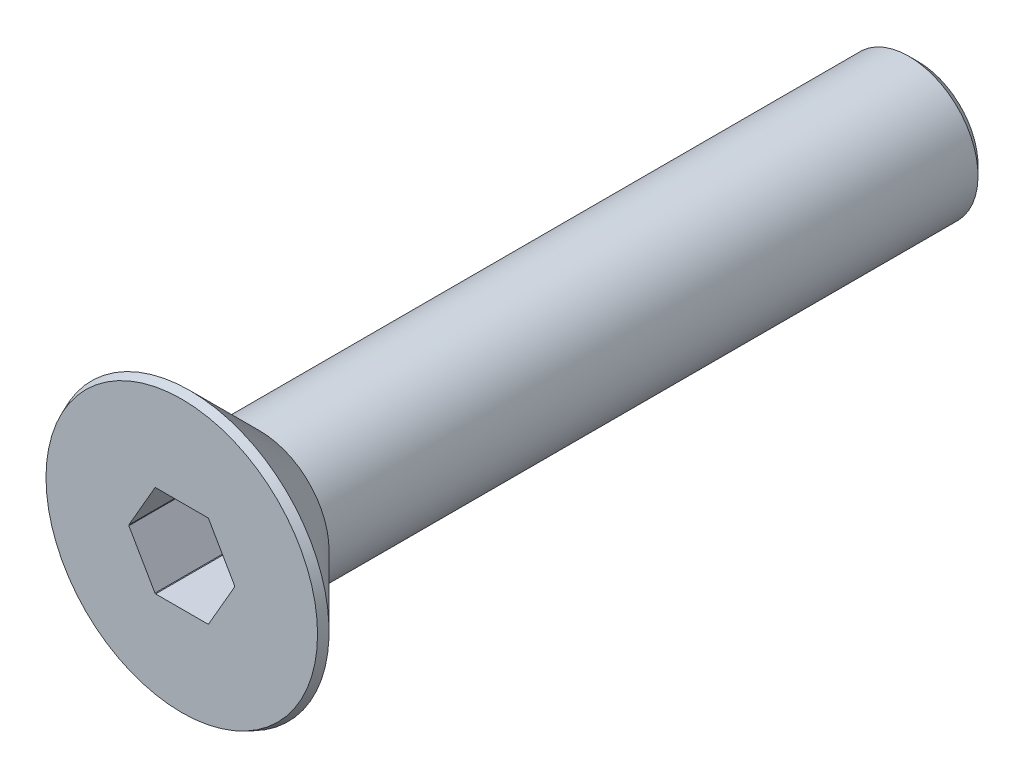
ISO-10303-21;
HEADER;
FILE_DESCRIPTION(('STEP AP214'),'2;1');
FILE_NAME('part.step','',(''),(''),'','','');
FILE_SCHEMA(('AUTOMOTIVE_DESIGN { 1 0 10303 214 1 1 1 1 }'));
ENDSEC;
DATA;
#1=APPLICATION_CONTEXT('core data for automotive mechanical design processes');
#2=APPLICATION_PROTOCOL_DEFINITION('international standard','automotive_design',2000,#1);
#3=PRODUCT_CONTEXT('',#1,'mechanical');
#4=PRODUCT('Part','Part','',(#3));
#5=PRODUCT_RELATED_PRODUCT_CATEGORY('part','',(#4));
#6=PRODUCT_DEFINITION_FORMATION('','',#4);
#7=PRODUCT_DEFINITION_CONTEXT('part definition',#1,'design');
#8=PRODUCT_DEFINITION('design','',#6,#7);
#9=PRODUCT_DEFINITION_SHAPE('','',#8);
#10=(LENGTH_UNIT() NAMED_UNIT(*) SI_UNIT(.MILLI.,.METRE.));
#11=(NAMED_UNIT(*) PLANE_ANGLE_UNIT() SI_UNIT($,.RADIAN.));
#12=(NAMED_UNIT(*) SI_UNIT($,.STERADIAN.) SOLID_ANGLE_UNIT());
#13=UNCERTAINTY_MEASURE_WITH_UNIT(LENGTH_MEASURE(1.E-05),#10,'distance_accuracy_value','');
#14=(GEOMETRIC_REPRESENTATION_CONTEXT(3) GLOBAL_UNCERTAINTY_ASSIGNED_CONTEXT((#13)) GLOBAL_UNIT_ASSIGNED_CONTEXT((#10,
#11,#12)) REPRESENTATION_CONTEXT('',''));
#15=CARTESIAN_POINT('',(0.,0.,0.));
#16=DIRECTION('',(0.,0.,1.));
#17=DIRECTION('',(1.,0.,0.));
#18=AXIS2_PLACEMENT_3D('',#15,#16,#17);
#19=CARTESIAN_POINT('',(0.,0.,-1.7));
#20=DIRECTION('',(0.,0.,1.));
#21=DIRECTION('',(0.,-1.,0.));
#22=AXIS2_PLACEMENT_3D('',#19,#20,#21);
#23=CYLINDRICAL_SURFACE('',#22,1.15);
#24=CARTESIAN_POINT('',(0.,0.,-1.7));
#25=DIRECTION('',(0.,0.,1.));
#26=DIRECTION('',(0.,-1.,0.));
#27=AXIS2_PLACEMENT_3D('',#24,#25,#26);
#28=CIRCLE('',#27,1.15);
#29=CARTESIAN_POINT('',(0.582079986494721,0.991807889322787,-1.69999999999627));
#30=VERTEX_POINT('',#29);
#31=CARTESIAN_POINT('',(0.567890834580014,0.999999999999998,-1.69999999999638));
#32=VERTEX_POINT('',#31);
#33=EDGE_CURVE('E154',#30,#32,#28,.T.);
#34=ORIENTED_EDGE('',*,*,#33,.F.);
#35=DIRECTION('',(0.,0.,1.));
#36=VECTOR('',#35,1.);
#37=CARTESIAN_POINT('',(0.58207998649445,0.991807889323259,1.));
#38=LINE('',#37,#36);
#39=CARTESIAN_POINT('',(0.582079986494721,0.991807889322788,-2.84221464964295E-11));
#40=VERTEX_POINT('',#39);
#41=EDGE_CURVE('E139',#40,#30,#38,.F.);
#42=ORIENTED_EDGE('',*,*,#41,.F.);
#43=CARTESIAN_POINT('',(0.,0.,0.));
#44=DIRECTION('',(0.,0.,-1.));
#45=DIRECTION('',(0.,1.,0.));
#46=AXIS2_PLACEMENT_3D('',#43,#44,#45);
#47=CIRCLE('',#46,1.15);
#48=CARTESIAN_POINT('',(0.56789083458,0.999999999999999,-2.8422143111273E-11));
#49=VERTEX_POINT('',#48);
#50=EDGE_CURVE('E148',#49,#40,#47,.T.);
#51=ORIENTED_EDGE('',*,*,#50,.F.);
#52=DIRECTION('',(0.,0.,-1.));
#53=VECTOR('',#52,1.);
#54=CARTESIAN_POINT('',(0.56789083458,1.,1.));
#55=LINE('',#54,#53);
#56=EDGE_CURVE('E164',#32,#49,#55,.F.);
#57=ORIENTED_EDGE('',*,*,#56,.F.);
#58=EDGE_LOOP('',(#34,#42,#51,#57));
#59=FACE_BOUND('',#58,.T.);
#60=ADVANCED_FACE('F43',(#59),#23,.F.);
#61=CARTESIAN_POINT('',(0.,0.,-1.7));
#62=DIRECTION('',(0.,0.,1.));
#63=DIRECTION('',(0.,-1.,0.));
#64=AXIS2_PLACEMENT_3D('',#61,#62,#63);
#65=CYLINDRICAL_SURFACE('',#64,1.15);
#66=CARTESIAN_POINT('',(0.,0.,-1.7));
#67=DIRECTION('',(0.,0.,1.));
#68=DIRECTION('',(0.,-1.,0.));
#69=AXIS2_PLACEMENT_3D('',#66,#67,#68);
#70=CIRCLE('',#69,1.15);
#71=CARTESIAN_POINT('',(-0.567890834580014,0.999999999999998,-1.69999999999638));
#72=VERTEX_POINT('',#71);
#73=CARTESIAN_POINT('',(-0.582079986493683,0.991807889322995,-1.6999999999964));
#74=VERTEX_POINT('',#73);
#75=EDGE_CURVE('E422',#72,#74,#70,.T.);
#76=ORIENTED_EDGE('',*,*,#75,.F.);
#77=DIRECTION('',(0.,0.,-1.));
#78=VECTOR('',#77,1.);
#79=CARTESIAN_POINT('',(-0.56789083458,1.,1.));
#80=LINE('',#79,#78);
#81=CARTESIAN_POINT('',(-0.56789083458,0.999999999999999,-2.8422143111273E-11));
#82=VERTEX_POINT('',#81);
#83=EDGE_CURVE('E157',#82,#72,#80,.T.);
#84=ORIENTED_EDGE('',*,*,#83,.F.);
#85=CARTESIAN_POINT('',(0.,0.,0.));
#86=DIRECTION('',(0.,0.,-1.));
#87=DIRECTION('',(0.,1.,0.));
#88=AXIS2_PLACEMENT_3D('',#85,#86,#87);
#89=CIRCLE('',#88,1.15);
#90=CARTESIAN_POINT('',(-0.582079986493684,0.991807889322996,-2.84221464964295E-11));
#91=VERTEX_POINT('',#90);
#92=EDGE_CURVE('E309',#91,#82,#89,.T.);
#93=ORIENTED_EDGE('',*,*,#92,.F.);
#94=DIRECTION('',(0.,0.,1.));
#95=VECTOR('',#94,1.);
#96=CARTESIAN_POINT('',(-0.582079986493761,0.991807889322862,1.));
#97=LINE('',#96,#95);
#98=EDGE_CURVE('E208',#74,#91,#97,.T.);
#99=ORIENTED_EDGE('',*,*,#98,.F.);
#100=EDGE_LOOP('',(#76,#84,#93,#99));
#101=FACE_BOUND('',#100,.T.);
#102=ADVANCED_FACE('F448',(#101),#65,.F.);
#103=CARTESIAN_POINT('',(0.,0.,-1.7));
#104=DIRECTION('',(0.,0.,1.));
#105=DIRECTION('',(0.,-1.,0.));
#106=AXIS2_PLACEMENT_3D('',#103,#104,#105);
#107=CYLINDRICAL_SURFACE('',#106,1.15);
#108=CARTESIAN_POINT('',(0.,0.,-1.7));
#109=DIRECTION('',(0.,0.,1.));
#110=DIRECTION('',(0.,-1.,0.));
#111=AXIS2_PLACEMENT_3D('',#108,#109,#110);
#112=CIRCLE('',#111,1.15);
#113=CARTESIAN_POINT('',(-1.1499708210743,0.00819211067716921,-1.69999999999643));
#114=VERTEX_POINT('',#113);
#115=CARTESIAN_POINT('',(-1.14997082107464,-0.00819211067817647,-1.6999999999963));
#116=VERTEX_POINT('',#115);
#117=EDGE_CURVE('E417',#114,#116,#112,.T.);
#118=ORIENTED_EDGE('',*,*,#117,.F.);
#119=DIRECTION('',(0.,0.,1.));
#120=VECTOR('',#119,1.);
#121=CARTESIAN_POINT('',(-1.14997082107415,0.00819211067743609,1.));
#122=LINE('',#121,#120);
#123=CARTESIAN_POINT('',(-1.1499708210743,0.00819211067717038,-2.8421711249418E-11));
#124=VERTEX_POINT('',#123);
#125=EDGE_CURVE('E212',#124,#114,#122,.F.);
#126=ORIENTED_EDGE('',*,*,#125,.F.);
#127=CARTESIAN_POINT('',(0.,0.,0.));
#128=DIRECTION('',(0.,0.,-1.));
#129=DIRECTION('',(0.,1.,0.));
#130=AXIS2_PLACEMENT_3D('',#127,#128,#129);
#131=CIRCLE('',#130,1.15);
#132=CARTESIAN_POINT('',(-1.14997082107464,-0.00819211067817531,-2.842170761139E-11));
#133=VERTEX_POINT('',#132);
#134=EDGE_CURVE('E418',#133,#124,#131,.T.);
#135=ORIENTED_EDGE('',*,*,#134,.F.);
#136=DIRECTION('',(0.,0.,1.));
#137=VECTOR('',#136,1.);
#138=CARTESIAN_POINT('',(-1.14997082107484,-0.00819211067783492,1.));
#139=LINE('',#138,#137);
#140=EDGE_CURVE('E200',#116,#133,#139,.T.);
#141=ORIENTED_EDGE('',*,*,#140,.F.);
#142=EDGE_LOOP('',(#118,#126,#135,#141));
#143=FACE_BOUND('',#142,.T.);
#144=ADVANCED_FACE('F453',(#143),#107,.F.);
#145=CARTESIAN_POINT('',(0.,0.,-1.7));
#146=DIRECTION('',(0.,0.,1.));
#147=DIRECTION('',(0.,-1.,0.));
#148=AXIS2_PLACEMENT_3D('',#145,#146,#147);
#149=CYLINDRICAL_SURFACE('',#148,1.15);
#150=CARTESIAN_POINT('',(0.,0.,-1.7));
#151=DIRECTION('',(0.,0.,1.));
#152=DIRECTION('',(0.,-1.,0.));
#153=AXIS2_PLACEMENT_3D('',#150,#151,#152);
#154=CIRCLE('',#153,1.15);
#155=CARTESIAN_POINT('',(-0.582079986494723,-0.991807889322789,-1.69999999999627));
#156=VERTEX_POINT('',#155);
#157=CARTESIAN_POINT('',(-0.567890834580013,-1.,-1.69999999999637));
#158=VERTEX_POINT('',#157);
#159=EDGE_CURVE('E175',#156,#158,#154,.T.);
#160=ORIENTED_EDGE('',*,*,#159,.F.);
#161=DIRECTION('',(0.,0.,1.));
#162=VECTOR('',#161,1.);
#163=CARTESIAN_POINT('',(-0.58207998649445,-0.991807889323259,1.));
#164=LINE('',#163,#162);
#165=CARTESIAN_POINT('',(-0.582079986494723,-0.991807889322788,-2.84212723643786E-11));
#166=VERTEX_POINT('',#165);
#167=EDGE_CURVE('E204',#166,#156,#164,.F.);
#168=ORIENTED_EDGE('',*,*,#167,.F.);
#169=CARTESIAN_POINT('',(0.,0.,0.));
#170=DIRECTION('',(0.,0.,-1.));
#171=DIRECTION('',(0.,1.,0.));
#172=AXIS2_PLACEMENT_3D('',#169,#170,#171);
#173=CIRCLE('',#172,1.15);
#174=CARTESIAN_POINT('',(-0.567890834580013,-1.,-2.84212705453646E-11));
#175=VERTEX_POINT('',#174);
#176=EDGE_CURVE('E413',#175,#166,#173,.T.);
#177=ORIENTED_EDGE('',*,*,#176,.F.);
#178=DIRECTION('',(0.,0.,1.));
#179=VECTOR('',#178,1.);
#180=CARTESIAN_POINT('',(-0.56789083458,-1.,1.));
#181=LINE('',#180,#179);
#182=EDGE_CURVE('E192',#158,#175,#181,.T.);
#183=ORIENTED_EDGE('',*,*,#182,.F.);
#184=EDGE_LOOP('',(#160,#168,#177,#183));
#185=FACE_BOUND('',#184,.T.);
#186=ADVANCED_FACE('F457',(#185),#149,.F.);
#187=CARTESIAN_POINT('',(0.,0.,-1.7));
#188=DIRECTION('',(0.,0.,1.));
#189=DIRECTION('',(0.,-1.,0.));
#190=AXIS2_PLACEMENT_3D('',#187,#188,#189);
#191=CYLINDRICAL_SURFACE('',#190,1.15);
#192=CARTESIAN_POINT('',(0.,0.,-1.7));
#193=DIRECTION('',(0.,0.,1.));
#194=DIRECTION('',(0.,-1.,0.));
#195=AXIS2_PLACEMENT_3D('',#192,#193,#194);
#196=CIRCLE('',#195,1.15);
#197=CARTESIAN_POINT('',(0.567890834580013,-1.,-1.69999999999637));
#198=VERTEX_POINT('',#197);
#199=CARTESIAN_POINT('',(0.582079986493684,-0.991807889322997,-1.6999999999964));
#200=VERTEX_POINT('',#199);
#201=EDGE_CURVE('E158',#198,#200,#196,.T.);
#202=ORIENTED_EDGE('',*,*,#201,.F.);
#203=DIRECTION('',(0.,0.,1.));
#204=VECTOR('',#203,1.);
#205=CARTESIAN_POINT('',(0.56789083458,-1.,1.));
#206=LINE('',#205,#204);
#207=CARTESIAN_POINT('',(0.567890834580013,-1.,-2.84212705453646E-11));
#208=VERTEX_POINT('',#207);
#209=EDGE_CURVE('E196',#208,#198,#206,.F.);
#210=ORIENTED_EDGE('',*,*,#209,.F.);
#211=CARTESIAN_POINT('',(0.,0.,0.));
#212=DIRECTION('',(0.,0.,-1.));
#213=DIRECTION('',(0.,1.,0.));
#214=AXIS2_PLACEMENT_3D('',#211,#212,#213);
#215=CIRCLE('',#214,1.15);
#216=CARTESIAN_POINT('',(0.582079986493684,-0.991807889322996,-2.84212723643786E-11));
#217=VERTEX_POINT('',#216);
#218=EDGE_CURVE('E166',#217,#208,#215,.T.);
#219=ORIENTED_EDGE('',*,*,#218,.F.);
#220=DIRECTION('',(0.,0.,1.));
#221=VECTOR('',#220,1.);
#222=CARTESIAN_POINT('',(0.582079986493761,-0.991807889322862,1.));
#223=LINE('',#222,#221);
#224=EDGE_CURVE('E187',#200,#217,#223,.T.);
#225=ORIENTED_EDGE('',*,*,#224,.F.);
#226=EDGE_LOOP('',(#202,#210,#219,#225));
#227=FACE_BOUND('',#226,.T.);
#228=ADVANCED_FACE('F475',(#227),#191,.F.);
#229=CARTESIAN_POINT('',(0.57735026919,1.,1.));
#230=DIRECTION('',(-0.866025403784329,-0.50000000000019,0.));
#231=DIRECTION('',(0.50000000000019,-0.866025403784329,0.));
#232=AXIS2_PLACEMENT_3D('',#229,#230,#231);
#233=PLANE('',#232);
#234=CARTESIAN_POINT('',(0.582079986491966,0.991807889327558,-1.69999999999166));
#235=CARTESIAN_POINT('',(0.605600596253279,0.951068998195986,-1.70845815070661));
#236=CARTESIAN_POINT('',(0.629197422105134,0.910198096923238,-1.71614445439344));
#237=CARTESIAN_POINT('',(0.676540507615952,0.828197467431465,-1.72965771299832));
#238=CARTESIAN_POINT('',(0.700286864543365,0.787067570738541,-1.73548329417145));
#239=CARTESIAN_POINT('',(0.747672584468559,0.704993096274919,-1.74490256972869));
#240=CARTESIAN_POINT('',(0.771310925536952,0.66405028853784,-1.74851628107554));
#241=CARTESIAN_POINT('',(0.818641326983931,0.582071628489082,-1.75336238300267));
#242=CARTESIAN_POINT('',(0.842333365384311,0.541035814244772,-1.75459561609425));
#243=CARTESIAN_POINT('',(0.88971744218507,0.458964185756152,-1.75459561609425));
#244=CARTESIAN_POINT('',(0.91340948058545,0.417928371511843,-1.75336238300267));
#245=CARTESIAN_POINT('',(0.960739882032429,0.335949711463085,-1.74851628107555));
#246=CARTESIAN_POINT('',(0.984378223100823,0.295006903726005,-1.7449025697287));
#247=CARTESIAN_POINT('',(1.03176394302602,0.212932429262382,-1.73548329417146));
#248=CARTESIAN_POINT('',(1.05551029995343,0.171802532569459,-1.72965771299833));
#249=CARTESIAN_POINT('',(1.10285338546425,0.0898019030776858,-1.71614445439345));
#250=CARTESIAN_POINT('',(1.1264502113161,0.0489310018049376,-1.70845815070663));
#251=CARTESIAN_POINT('',(1.14997082107742,0.00819211067336481,-1.69999999999168));
#252=B_SPLINE_CURVE_WITH_KNOTS('',3,(#234,#235,#236,#237,#238,#239,#240,#241,#242,#243,#244,
#245,#246,#247,#248,#249,#250,#251),.UNSPECIFIED.,.F.,.F.,(4,2,2,2,2,2,2,2,4),(0.,
0.143400587532756,0.286906802266953,0.429094334758283,0.571231534260703,0.713368733763123,
0.855556266254454,0.999062480988651,1.14246306852141),.UNSPECIFIED.);
#253=CARTESIAN_POINT('',(1.14997082107593,0.00819211067535805,-1.69999999999584));
#254=VERTEX_POINT('',#253);
#255=EDGE_CURVE('E172',#30,#254,#252,.T.);
#256=ORIENTED_EDGE('',*,*,#255,.T.);
#257=DIRECTION('',(0.,0.,1.));
#258=VECTOR('',#257,1.);
#259=CARTESIAN_POINT('',(1.14997082107445,0.0081921106773511,-1.7));
#260=LINE('',#259,#258);
#261=CARTESIAN_POINT('',(1.14997082107219,0.00819211068184096,-2.8421711249418E-11));
#262=VERTEX_POINT('',#261);
#263=EDGE_CURVE('E142',#254,#262,#260,.T.);
#264=ORIENTED_EDGE('',*,*,#263,.T.);
#265=DIRECTION('',(0.50000000000019,-0.866025403784329,0.));
#266=VECTOR('',#265,1.);
#267=CARTESIAN_POINT('',(0.57735026919,0.999999999999999,0.));
#268=LINE('',#267,#266);
#269=EDGE_CURVE('E135',#40,#262,#268,.T.);
#270=ORIENTED_EDGE('',*,*,#269,.F.);
#271=ORIENTED_EDGE('',*,*,#41,.T.);
#272=EDGE_LOOP('',(#256,#264,#270,#271));
#273=FACE_BOUND('',#272,.T.);
#274=ADVANCED_FACE('F137',(#273),#233,.T.);
#275=CARTESIAN_POINT('',(-0.57735026919,1.,1.));
#276=DIRECTION('',(0.,-1.,0.));
#277=DIRECTION('',(0.,0.,-1.));
#278=AXIS2_PLACEMENT_3D('',#275,#276,#277);
#279=PLANE('',#278);
#280=CARTESIAN_POINT('',(-0.567890834585023,0.999999999999998,-1.69999999999185));
#281=CARTESIAN_POINT('',(-0.520849615062434,0.999999999999998,-1.7084581507068));
#282=CARTESIAN_POINT('',(-0.473655963358758,0.999999999999998,-1.71614445439362));
#283=CARTESIAN_POINT('',(-0.378969792337193,0.999999999999998,-1.7296577129985));
#284=CARTESIAN_POINT('',(-0.331477078482403,0.999999999999998,-1.73548329417163));
#285=CARTESIAN_POINT('',(-0.236705638632087,0.999999999999998,-1.74490256972887));
#286=CARTESIAN_POINT('',(-0.189428956495335,0.999999999999998,-1.74851628107571));
#287=CARTESIAN_POINT('',(-0.094768153601448,0.999999999999998,-1.75336238300283));
#288=CARTESIAN_POINT('',(-0.047384076800724,0.999999999999998,-1.75459561609442));
#289=CARTESIAN_POINT('',(0.0473840768007239,0.999999999999998,-1.75459561609442));
#290=CARTESIAN_POINT('',(0.0947681536014478,0.999999999999998,-1.75336238300283));
#291=CARTESIAN_POINT('',(0.189428956495335,0.999999999999998,-1.74851628107571));
#292=CARTESIAN_POINT('',(0.236705638632087,0.999999999999998,-1.74490256972887));
#293=CARTESIAN_POINT('',(0.331477078482403,0.999999999999998,-1.73548329417163));
#294=CARTESIAN_POINT('',(0.378969792337193,0.999999999999998,-1.7296577129985));
#295=CARTESIAN_POINT('',(0.473655963358758,0.999999999999998,-1.71614445439362));
#296=CARTESIAN_POINT('',(0.520849615062434,0.999999999999998,-1.7084581507068));
#297=CARTESIAN_POINT('',(0.567890834585023,0.999999999999998,-1.69999999999185));
#298=B_SPLINE_CURVE_WITH_KNOTS('',3,(#280,#281,#282,#283,#284,#285,#286,#287,#288,#289,#290,
#291,#292,#293,#294,#295,#296,#297),.UNSPECIFIED.,.F.,.F.,(4,2,2,2,2,2,2,2,4),(0.,
0.143400587532703,0.286906802266847,0.429094334758125,0.571231534260492,0.71336873376286,
0.855556266254137,0.999062480988282,1.14246306852098),.UNSPECIFIED.);
#299=EDGE_CURVE('E221',#72,#32,#298,.T.);
#300=ORIENTED_EDGE('',*,*,#299,.T.);
#301=ORIENTED_EDGE('',*,*,#56,.T.);
#302=DIRECTION('',(1.,0.,0.));
#303=VECTOR('',#302,1.);
#304=CARTESIAN_POINT('',(-0.57735026919,0.999999999999999,0.));
#305=LINE('',#304,#303);
#306=EDGE_CURVE('E129',#82,#49,#305,.T.);
#307=ORIENTED_EDGE('',*,*,#306,.F.);
#308=ORIENTED_EDGE('',*,*,#83,.T.);
#309=EDGE_LOOP('',(#300,#301,#307,#308));
#310=FACE_BOUND('',#309,.T.);
#311=ADVANCED_FACE('F219',(#310),#279,.T.);
#312=CARTESIAN_POINT('',(-1.154700538379,0.,1.));
#313=DIRECTION('',(0.866025403784329,-0.50000000000019,0.));
#314=DIRECTION('',(0.50000000000019,0.866025403784329,0.));
#315=AXIS2_PLACEMENT_3D('',#312,#313,#314);
#316=PLANE('',#315);
#317=CARTESIAN_POINT('',(-1.14997082107672,0.00819211067297687,-1.69999999999193));
#318=CARTESIAN_POINT('',(-1.12645021131541,0.0489310018045507,-1.70845815070689));
#319=CARTESIAN_POINT('',(-1.10285338546355,0.0898019030773,-1.71614445439372));
#320=CARTESIAN_POINT('',(-1.05551029995273,0.171802532569076,-1.72965771299861));
#321=CARTESIAN_POINT('',(-1.03176394302532,0.212932429262001,-1.73548329417174));
#322=CARTESIAN_POINT('',(-0.984378223100124,0.295006903725626,-1.74490256972899));
#323=CARTESIAN_POINT('',(-0.96073988203173,0.335949711462707,-1.74851628107584));
#324=CARTESIAN_POINT('',(-0.913409480584749,0.417928371511467,-1.75336238300296));
#325=CARTESIAN_POINT('',(-0.889717442184369,0.458964185755778,-1.75459561609454));
#326=CARTESIAN_POINT('',(-0.842333365383608,0.5410358142444,-1.75459561609454));
#327=CARTESIAN_POINT('',(-0.818641326983228,0.582071628488711,-1.75336238300295));
#328=CARTESIAN_POINT('',(-0.771310925536247,0.664050288537472,-1.74851628107583));
#329=CARTESIAN_POINT('',(-0.747672584467853,0.704993096274552,-1.74490256972897));
#330=CARTESIAN_POINT('',(-0.700286864542658,0.787067570738177,-1.73548329417172));
#331=CARTESIAN_POINT('',(-0.676540507615244,0.828197467431101,-1.72965771299859));
#332=CARTESIAN_POINT('',(-0.629197422104425,0.910198096922877,-1.71614445439369));
#333=CARTESIAN_POINT('',(-0.605600596252569,0.951068998195626,-1.70845815070686));
#334=CARTESIAN_POINT('',(-0.582079986491256,0.991807889327199,-1.6999999999919));
#335=B_SPLINE_CURVE_WITH_KNOTS('',3,(#317,#318,#319,#320,#321,#322,#323,#324,#325,#326,#327,
#328,#329,#330,#331,#332,#333,#334),.UNSPECIFIED.,.F.,.F.,(4,2,2,2,2,2,2,2,4),(0.,
0.143400587532762,0.286906802266966,0.429094334758301,0.571231534260725,0.71336873376315,
0.855556266254485,0.999062480988688,1.14246306852145),.UNSPECIFIED.);
#336=EDGE_CURVE('E225',#114,#74,#335,.T.);
#337=ORIENTED_EDGE('',*,*,#336,.T.);
#338=ORIENTED_EDGE('',*,*,#98,.T.);
#339=DIRECTION('',(0.50000000000019,0.866025403784329,0.));
#340=VECTOR('',#339,1.);
#341=CARTESIAN_POINT('',(-1.154700538379,0.,0.));
#342=LINE('',#341,#340);
#343=EDGE_CURVE('E146',#124,#91,#342,.T.);
#344=ORIENTED_EDGE('',*,*,#343,.F.);
#345=ORIENTED_EDGE('',*,*,#125,.T.);
#346=EDGE_LOOP('',(#337,#338,#344,#345));
#347=FACE_BOUND('',#346,.T.);
#348=ADVANCED_FACE('F284',(#347),#316,.T.);
#349=CARTESIAN_POINT('',(-0.57735026919,-1.,1.));
#350=DIRECTION('',(0.866025403784329,0.50000000000019,0.));
#351=DIRECTION('',(-0.50000000000019,0.866025403784329,0.));
#352=AXIS2_PLACEMENT_3D('',#349,#350,#351);
#353=PLANE('',#352);
#354=CARTESIAN_POINT('',(-0.582079986491968,-0.99180788932756,-1.69999999999166));
#355=CARTESIAN_POINT('',(-0.605600596253279,-0.951068998195989,-1.70845815070661));
#356=CARTESIAN_POINT('',(-0.629197422105134,-0.910198096923243,-1.71614445439343));
#357=CARTESIAN_POINT('',(-0.676540507615949,-0.828197467431475,-1.72965771299832));
#358=CARTESIAN_POINT('',(-0.700286864543361,-0.787067570738554,-1.73548329417145));
#359=CARTESIAN_POINT('',(-0.747672584468552,-0.704993096274935,-1.74490256972869));
#360=CARTESIAN_POINT('',(-0.771310925536944,-0.664050288537858,-1.74851628107554));
#361=CARTESIAN_POINT('',(-0.818641326983921,-0.582071628489105,-1.75336238300266));
#362=CARTESIAN_POINT('',(-0.842333365384299,-0.541035814244797,-1.75459561609425));
#363=CARTESIAN_POINT('',(-0.889717442185056,-0.458964185756182,-1.75459561609425));
#364=CARTESIAN_POINT('',(-0.913409480585435,-0.417928371511874,-1.75336238300267));
#365=CARTESIAN_POINT('',(-0.960739882032412,-0.33594971146312,-1.74851628107555));
#366=CARTESIAN_POINT('',(-0.984378223100804,-0.295006903726043,-1.74490256972871));
#367=CARTESIAN_POINT('',(-1.031763943026,-0.212932429262424,-1.73548329417147));
#368=CARTESIAN_POINT('',(-1.05551029995341,-0.171802532569503,-1.72965771299834));
#369=CARTESIAN_POINT('',(-1.10285338546422,-0.0898019030777332,-1.71614445439346));
#370=CARTESIAN_POINT('',(-1.12645021131608,-0.048931001804987,-1.70845815070664));
#371=CARTESIAN_POINT('',(-1.14997082107739,-0.00819211067341607,-1.69999999999169));
#372=B_SPLINE_CURVE_WITH_KNOTS('',3,(#354,#355,#356,#357,#358,#359,#360,#361,#362,#363,#364,
#365,#366,#367,#368,#369,#370,#371),.UNSPECIFIED.,.F.,.F.,(4,2,2,2,2,2,2,2,4),(0.,
0.143400587532748,0.286906802266938,0.429094334758261,0.571231534260674,0.713368733763087,
0.85555626625441,0.9990624809886,1.14246306852135),.UNSPECIFIED.);
#373=EDGE_CURVE('E232',#156,#116,#372,.T.);
#374=ORIENTED_EDGE('',*,*,#373,.T.);
#375=ORIENTED_EDGE('',*,*,#140,.T.);
#376=DIRECTION('',(0.50000000000019,-0.866025403784329,0.));
#377=VECTOR('',#376,1.);
#378=CARTESIAN_POINT('',(-0.86602540378472,-0.500000000000415,0.));
#379=LINE('',#378,#377);
#380=EDGE_CURVE('E145',#133,#166,#379,.T.);
#381=ORIENTED_EDGE('',*,*,#380,.T.);
#382=ORIENTED_EDGE('',*,*,#167,.T.);
#383=EDGE_LOOP('',(#374,#375,#381,#382));
#384=FACE_BOUND('',#383,.T.);
#385=ADVANCED_FACE('F280',(#384),#353,.T.);
#386=CARTESIAN_POINT('',(0.57735026919,-1.,1.));
#387=DIRECTION('',(0.,1.,0.));
#388=DIRECTION('',(0.,0.,1.));
#389=AXIS2_PLACEMENT_3D('',#386,#387,#388);
#390=PLANE('',#389);
#391=CARTESIAN_POINT('',(0.567890834585023,-1.,-1.69999999999184));
#392=CARTESIAN_POINT('',(0.520849615062434,-1.,-1.7084581507068));
#393=CARTESIAN_POINT('',(0.473655963358758,-1.,-1.71614445439362));
#394=CARTESIAN_POINT('',(0.378969792337193,-1.,-1.7296577129985));
#395=CARTESIAN_POINT('',(0.331477078482403,-1.,-1.73548329417163));
#396=CARTESIAN_POINT('',(0.236705638632087,-1.,-1.74490256972886));
#397=CARTESIAN_POINT('',(0.189428956495335,-1.,-1.74851628107571));
#398=CARTESIAN_POINT('',(0.0947681536014475,-1.,-1.75336238300283));
#399=CARTESIAN_POINT('',(0.0473840768007235,-1.,-1.75459561609441));
#400=CARTESIAN_POINT('',(-0.0473840768007244,-1.,-1.75459561609441));
#401=CARTESIAN_POINT('',(-0.0947681536014484,-1.,-1.75336238300283));
#402=CARTESIAN_POINT('',(-0.189428956495336,-1.,-1.74851628107571));
#403=CARTESIAN_POINT('',(-0.236705638632088,-1.,-1.74490256972886));
#404=CARTESIAN_POINT('',(-0.331477078482404,-1.,-1.73548329417163));
#405=CARTESIAN_POINT('',(-0.378969792337194,-1.,-1.7296577129985));
#406=CARTESIAN_POINT('',(-0.473655963358759,-1.,-1.71614445439362));
#407=CARTESIAN_POINT('',(-0.520849615062435,-1.,-1.7084581507068));
#408=CARTESIAN_POINT('',(-0.567890834585024,-1.,-1.69999999999184));
#409=B_SPLINE_CURVE_WITH_KNOTS('',3,(#391,#392,#393,#394,#395,#396,#397,#398,#399,#400,#401,
#402,#403,#404,#405,#406,#407,#408),.UNSPECIFIED.,.F.,.F.,(4,2,2,2,2,2,2,2,4),(0.,
0.143400587532703,0.286906802266847,0.429094334758125,0.571231534260493,0.71336873376286,
0.855556266254138,0.999062480988282,1.14246306852099),.UNSPECIFIED.);
#410=EDGE_CURVE('E263',#198,#158,#409,.T.);
#411=ORIENTED_EDGE('',*,*,#410,.T.);
#412=ORIENTED_EDGE('',*,*,#182,.T.);
#413=DIRECTION('',(1.,0.,0.));
#414=VECTOR('',#413,1.);
#415=CARTESIAN_POINT('',(0.,-1.,0.));
#416=LINE('',#415,#414);
#417=EDGE_CURVE('E313',#175,#208,#416,.T.);
#418=ORIENTED_EDGE('',*,*,#417,.T.);
#419=ORIENTED_EDGE('',*,*,#209,.T.);
#420=EDGE_LOOP('',(#411,#412,#418,#419));
#421=FACE_BOUND('',#420,.T.);
#422=ADVANCED_FACE('F283',(#421),#390,.T.);
#423=CARTESIAN_POINT('',(1.154700538379,0.,1.));
#424=DIRECTION('',(-0.866025403784329,0.50000000000019,0.));
#425=DIRECTION('',(-0.50000000000019,-0.866025403784329,0.));
#426=AXIS2_PLACEMENT_3D('',#423,#424,#425);
#427=PLANE('',#426);
#428=CARTESIAN_POINT('',(1.14997082107675,-0.00819211067293378,-1.69999999999192));
#429=CARTESIAN_POINT('',(1.12645021131543,-0.0489310018045094,-1.70845815070688));
#430=CARTESIAN_POINT('',(1.10285338546358,-0.0898019030772605,-1.71614445439371));
#431=CARTESIAN_POINT('',(1.05551029995276,-0.17180253256904,-1.7296577129986));
#432=CARTESIAN_POINT('',(1.03176394302534,-0.212932429261967,-1.73548329417174));
#433=CARTESIAN_POINT('',(0.984378223100144,-0.295006903725596,-1.74490256972898));
#434=CARTESIAN_POINT('',(0.960739882031748,-0.335949711462678,-1.74851628107583));
#435=CARTESIAN_POINT('',(0.913409480584766,-0.417928371511442,-1.75336238300296));
#436=CARTESIAN_POINT('',(0.889717442184384,-0.458964185755755,-1.75459561609454));
#437=CARTESIAN_POINT('',(0.842333365383621,-0.541035814244381,-1.75459561609454));
#438=CARTESIAN_POINT('',(0.81864132698324,-0.582071628488694,-1.75336238300295));
#439=CARTESIAN_POINT('',(0.771310925536257,-0.664050288537457,-1.74851628107583));
#440=CARTESIAN_POINT('',(0.747672584467862,-0.704993096274539,-1.74490256972897));
#441=CARTESIAN_POINT('',(0.700286864542665,-0.787067570738168,-1.73548329417172));
#442=CARTESIAN_POINT('',(0.67654050761525,-0.828197467431095,-1.72965771299859));
#443=CARTESIAN_POINT('',(0.629197422104429,-0.910198096922874,-1.71614445439369));
#444=CARTESIAN_POINT('',(0.605600596252571,-0.951068998195625,-1.70845815070686));
#445=CARTESIAN_POINT('',(0.582079986491257,-0.9918078893272,-1.6999999999919));
#446=B_SPLINE_CURVE_WITH_KNOTS('',3,(#428,#429,#430,#431,#432,#433,#434,#435,#436,#437,#438,
#439,#440,#441,#442,#443,#444,#445),.UNSPECIFIED.,.F.,.F.,(4,2,2,2,2,2,2,2,4),(0.,
0.143400587532769,0.286906802266979,0.42909433475832,0.571231534260751,0.713368733763181,
0.855556266254523,0.999062480988733,1.1424630685215),.UNSPECIFIED.);
#447=CARTESIAN_POINT('',(1.1499708210756,-0.00819211067514478,-1.69999999999596));
#448=VERTEX_POINT('',#447);
#449=EDGE_CURVE('E191',#448,#200,#446,.T.);
#450=ORIENTED_EDGE('',*,*,#449,.T.);
#451=ORIENTED_EDGE('',*,*,#224,.T.);
#452=DIRECTION('',(0.50000000000019,0.866025403784329,0.));
#453=VECTOR('',#452,1.);
#454=CARTESIAN_POINT('',(0.866025403784031,-0.500000000000018,0.));
#455=LINE('',#454,#453);
#456=CARTESIAN_POINT('',(1.14997082107222,-0.0081921106773384,-2.842170761139E-11));
#457=VERTEX_POINT('',#456);
#458=EDGE_CURVE('E60',#217,#457,#455,.T.);
#459=ORIENTED_EDGE('',*,*,#458,.T.);
#460=DIRECTION('',(0.,0.,1.));
#461=VECTOR('',#460,1.);
#462=CARTESIAN_POINT('',(1.14997082107445,-0.00819211067735579,-1.7));
#463=LINE('',#462,#461);
#464=EDGE_CURVE('E171',#457,#448,#463,.F.);
#465=ORIENTED_EDGE('',*,*,#464,.T.);
#466=EDGE_LOOP('',(#450,#451,#459,#465));
#467=FACE_BOUND('',#466,.T.);
#468=ADVANCED_FACE('F256',(#467),#427,.T.);
#469=CARTESIAN_POINT('',(0.,0.,-1.70000000005643));
#470=DIRECTION('',(0.,0.,1.));
#471=DIRECTION('',(0.,-1.,0.));
#472=AXIS2_PLACEMENT_3D('',#469,#470,#471);
#473=CONICAL_SURFACE('',#472,1.14999999982501,1.22172999978934);
#474=CARTESIAN_POINT('',(0.,0.,-1.7));
#475=DIRECTION('',(0.,0.,1.));
#476=DIRECTION('',(0.,-1.,0.));
#477=AXIS2_PLACEMENT_3D('',#474,#475,#476);
#478=CIRCLE('',#477,1.15);
#479=EDGE_CURVE('E185',#448,#254,#478,.T.);
#480=ORIENTED_EDGE('',*,*,#479,.T.);
#481=ORIENTED_EDGE('',*,*,#255,.F.);
#482=ORIENTED_EDGE('',*,*,#33,.T.);
#483=ORIENTED_EDGE('',*,*,#299,.F.);
#484=ORIENTED_EDGE('',*,*,#75,.T.);
#485=ORIENTED_EDGE('',*,*,#336,.F.);
#486=ORIENTED_EDGE('',*,*,#117,.T.);
#487=ORIENTED_EDGE('',*,*,#373,.F.);
#488=ORIENTED_EDGE('',*,*,#159,.T.);
#489=ORIENTED_EDGE('',*,*,#410,.F.);
#490=ORIENTED_EDGE('',*,*,#201,.T.);
#491=ORIENTED_EDGE('',*,*,#449,.F.);
#492=EDGE_LOOP('',(#480,#481,#482,#483,#484,#485,#486,#487,#488,#489,#490,#491));
#493=FACE_BOUND('',#492,.T.);
#494=CARTESIAN_POINT('',(-3.41060513164848E-10,0.,-2.11856638998142));
#495=VERTEX_POINT('',#494);
#496=VERTEX_LOOP('',#495);
#497=FACE_BOUND('',#496,.T.);
#498=ADVANCED_FACE('F250',(#493,#497),#473,.F.);
#499=CARTESIAN_POINT('',(0.,0.,-1.7));
#500=DIRECTION('',(0.,0.,1.));
#501=DIRECTION('',(0.,-1.,0.));
#502=AXIS2_PLACEMENT_3D('',#499,#500,#501);
#503=CYLINDRICAL_SURFACE('',#502,1.15);
#504=ORIENTED_EDGE('',*,*,#479,.F.);
#505=ORIENTED_EDGE('',*,*,#464,.F.);
#506=CARTESIAN_POINT('',(0.,0.,0.));
#507=DIRECTION('',(0.,0.,1.));
#508=DIRECTION('',(0.,-1.,0.));
#509=AXIS2_PLACEMENT_3D('',#506,#507,#508);
#510=CIRCLE('',#509,1.15);
#511=EDGE_CURVE('E363',#457,#262,#510,.T.);
#512=ORIENTED_EDGE('',*,*,#511,.T.);
#513=ORIENTED_EDGE('',*,*,#263,.F.);
#514=EDGE_LOOP('',(#504,#505,#512,#513));
#515=FACE_BOUND('',#514,.T.);
#516=ADVANCED_FACE('F255',(#515),#503,.F.);
#517=CARTESIAN_POINT('',(0.,0.,0.));
#518=DIRECTION('',(0.,0.,-1.));
#519=DIRECTION('',(0.,1.,0.));
#520=AXIS2_PLACEMENT_3D('',#517,#518,#519);
#521=PLANE('',#520);
#522=CARTESIAN_POINT('',(0.,0.,0.));
#523=DIRECTION('',(0.,0.,-1.));
#524=DIRECTION('',(0.,1.,0.));
#525=AXIS2_PLACEMENT_3D('',#522,#523,#524);
#526=CIRCLE('',#525,2.94999944438245);
#527=CARTESIAN_POINT('',(0.,2.94999944438245,0.));
#528=VERTEX_POINT('',#527);
#529=EDGE_CURVE('E319',#528,#528,#526,.F.);
#530=ORIENTED_EDGE('',*,*,#529,.T.);
#531=EDGE_LOOP('',(#530));
#532=FACE_BOUND('',#531,.T.);
#533=ORIENTED_EDGE('',*,*,#511,.F.);
#534=ORIENTED_EDGE('',*,*,#458,.F.);
#535=ORIENTED_EDGE('',*,*,#218,.T.);
#536=ORIENTED_EDGE('',*,*,#417,.F.);
#537=ORIENTED_EDGE('',*,*,#176,.T.);
#538=ORIENTED_EDGE('',*,*,#380,.F.);
#539=ORIENTED_EDGE('',*,*,#134,.T.);
#540=ORIENTED_EDGE('',*,*,#343,.T.);
#541=ORIENTED_EDGE('',*,*,#92,.T.);
#542=ORIENTED_EDGE('',*,*,#306,.T.);
#543=ORIENTED_EDGE('',*,*,#50,.T.);
#544=ORIENTED_EDGE('',*,*,#269,.T.);
#545=EDGE_LOOP('',(#533,#534,#535,#536,#537,#538,#539,#540,#541,#542,#543,#544));
#546=FACE_BOUND('',#545,.T.);
#547=ADVANCED_FACE('F149',(#532,#546),#521,.F.);
#548=CARTESIAN_POINT('',(0.,0.,-0.176776724288175));
#549=DIRECTION('',(0.,0.,1.));
#550=DIRECTION('',(0.,-1.,0.));
#551=AXIS2_PLACEMENT_3D('',#548,#549,#550);
#552=CONICAL_SURFACE('',#551,3.02322277792655,0.785398000001212);
#553=CARTESIAN_POINT('',(0.,0.,-0.176776724231332));
#554=DIRECTION('',(0.,0.,1.));
#555=DIRECTION('',(0.,-1.,0.));
#556=AXIS2_PLACEMENT_3D('',#553,#554,#555);
#557=CIRCLE('',#556,3.02322277798339);
#558=CARTESIAN_POINT('',(0.,-3.02322277798339,-0.17677672423133));
#559=VERTEX_POINT('',#558);
#560=EDGE_CURVE('E322',#559,#559,#557,.F.);
#561=ORIENTED_EDGE('',*,*,#560,.T.);
#562=EDGE_LOOP('',(#561));
#563=FACE_BOUND('',#562,.T.);
#564=CARTESIAN_POINT('',(0.,0.,-1.7));
#565=DIRECTION('',(0.,0.,-1.));
#566=DIRECTION('',(0.,1.,0.));
#567=AXIS2_PLACEMENT_3D('',#564,#565,#566);
#568=CIRCLE('',#567,1.5);
#569=CARTESIAN_POINT('',(0.,1.5,-1.7));
#570=VERTEX_POINT('',#569);
#571=EDGE_CURVE('E314',#570,#570,#568,.T.);
#572=ORIENTED_EDGE('',*,*,#571,.F.);
#573=EDGE_LOOP('',(#572));
#574=FACE_BOUND('',#573,.T.);
#575=ADVANCED_FACE('F339',(#563,#574),#552,.T.);
#576=CARTESIAN_POINT('',(0.,0.,-1.7));
#577=DIRECTION('',(0.,0.,-1.));
#578=DIRECTION('',(0.,1.,0.));
#579=AXIS2_PLACEMENT_3D('',#576,#577,#578);
#580=CYLINDRICAL_SURFACE('',#579,1.5);
#581=CARTESIAN_POINT('',(0.,0.,-15.8));
#582=DIRECTION('',(0.,0.,-1.));
#583=DIRECTION('',(0.,1.,0.));
#584=AXIS2_PLACEMENT_3D('',#581,#582,#583);
#585=CIRCLE('',#584,1.5);
#586=CARTESIAN_POINT('',(0.,1.49999999999999,-15.8));
#587=VERTEX_POINT('',#586);
#588=EDGE_CURVE('E13',#587,#587,#585,.F.);
#589=ORIENTED_EDGE('',*,*,#588,.T.);
#590=EDGE_LOOP('',(#589));
#591=FACE_BOUND('',#590,.T.);
#592=ORIENTED_EDGE('',*,*,#571,.T.);
#593=EDGE_LOOP('',(#592));
#594=FACE_BOUND('',#593,.T.);
#595=ADVANCED_FACE('F337',(#591,#594),#580,.T.);
#596=CARTESIAN_POINT('',(0.,0.,0.));
#597=DIRECTION('',(0.,0.,-1.));
#598=DIRECTION('',(0.,1.,0.));
#599=AXIS2_PLACEMENT_3D('',#596,#597,#598);
#600=CONICAL_SURFACE('',#599,2.94999944438245,0.392699163359146);
#601=ORIENTED_EDGE('',*,*,#560,.F.);
#602=EDGE_LOOP('',(#601));
#603=FACE_BOUND('',#602,.T.);
#604=ORIENTED_EDGE('',*,*,#529,.F.);
#605=EDGE_LOOP('',(#604));
#606=FACE_BOUND('',#605,.T.);
#607=ADVANCED_FACE('F334',(#603,#606),#600,.T.);
#608=CARTESIAN_POINT('',(0.,0.,-16.));
#609=DIRECTION('',(0.,0.,-1.));
#610=DIRECTION('',(0.,1.,0.));
#611=AXIS2_PLACEMENT_3D('',#608,#609,#610);
#612=PLANE('',#611);
#613=CARTESIAN_POINT('',(0.,0.,-16.));
#614=DIRECTION('',(0.,0.,-1.));
#615=DIRECTION('',(0.,1.,0.));
#616=AXIS2_PLACEMENT_3D('',#613,#614,#615);
#617=CIRCLE('',#616,1.3);
#618=CARTESIAN_POINT('',(0.,1.29999999999999,-16.));
#619=VERTEX_POINT('',#618);
#620=EDGE_CURVE('E52',#619,#619,#617,.T.);
#621=ORIENTED_EDGE('',*,*,#620,.T.);
#622=EDGE_LOOP('',(#621));
#623=FACE_BOUND('',#622,.T.);
#624=ADVANCED_FACE('F327',(#623),#612,.T.);
#625=CARTESIAN_POINT('',(0.,0.,-16.));
#626=DIRECTION('',(0.,0.,1.));
#627=DIRECTION('',(0.,-1.,0.));
#628=AXIS2_PLACEMENT_3D('',#625,#626,#627);
#629=CONICAL_SURFACE('',#628,1.3,0.785398163397447);
#630=ORIENTED_EDGE('',*,*,#588,.F.);
#631=EDGE_LOOP('',(#630));
#632=FACE_BOUND('',#631,.T.);
#633=ORIENTED_EDGE('',*,*,#620,.F.);
#634=EDGE_LOOP('',(#633));
#635=FACE_BOUND('',#634,.T.);
#636=ADVANCED_FACE('F45',(#632,#635),#629,.T.);
#637=CLOSED_SHELL('',(#60,#102,#144,#186,#228,#274,#311,#348,#385,#422,#468,#498,#516,#547,#575,
#595,#607,#624,#636));
#638=MANIFOLD_SOLID_BREP('B2',#637);
#639=ADVANCED_BREP_SHAPE_REPRESENTATION('',(#18,#638),#14);
#640=SHAPE_DEFINITION_REPRESENTATION(#9,#639);
ENDSEC;
END-ISO-10303-21;
